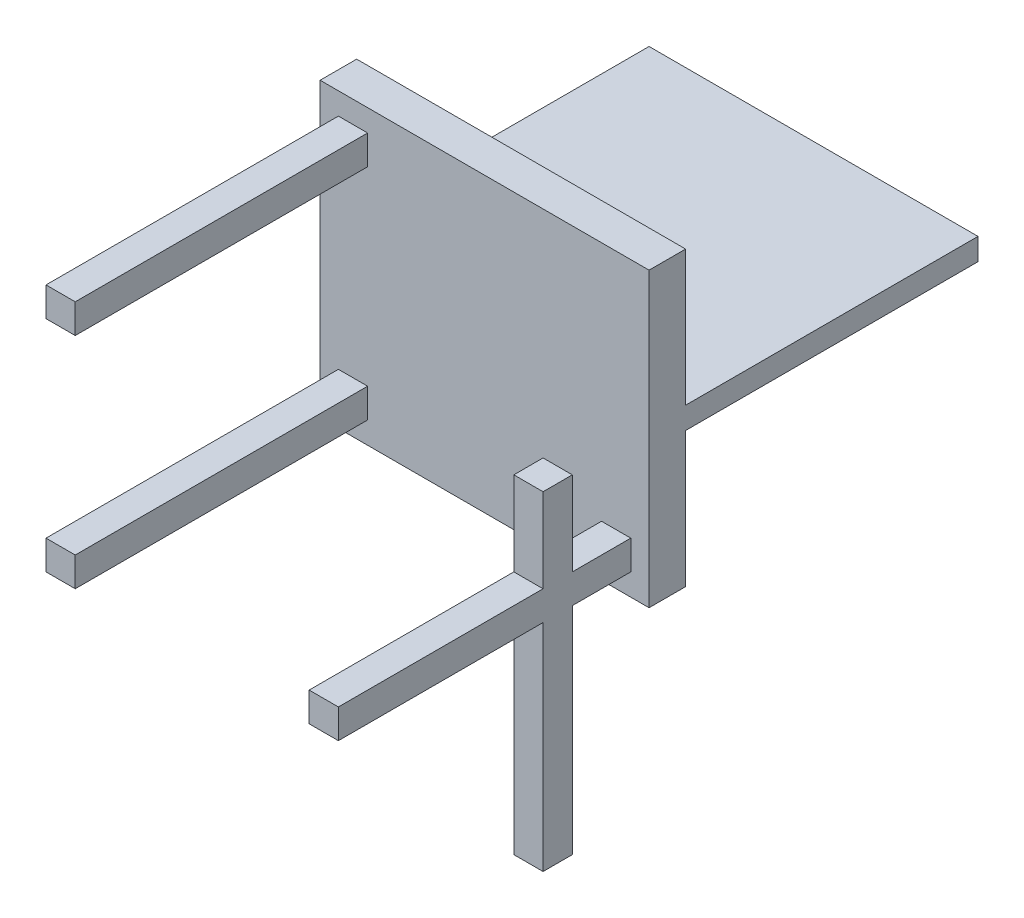
ISO-10303-21;
HEADER;
FILE_DESCRIPTION(('STEP AP214'),'2;1');
FILE_NAME('part.step','',(''),(''),'','','');
FILE_SCHEMA(('AUTOMOTIVE_DESIGN { 1 0 10303 214 1 1 1 1 }'));
ENDSEC;
DATA;
#1=APPLICATION_CONTEXT('core data for automotive mechanical design processes');
#2=APPLICATION_PROTOCOL_DEFINITION('international standard','automotive_design',2000,#1);
#3=PRODUCT_CONTEXT('',#1,'mechanical');
#4=PRODUCT('Part','Part','',(#3));
#5=PRODUCT_RELATED_PRODUCT_CATEGORY('part','',(#4));
#6=PRODUCT_DEFINITION_FORMATION('','',#4);
#7=PRODUCT_DEFINITION_CONTEXT('part definition',#1,'design');
#8=PRODUCT_DEFINITION('design','',#6,#7);
#9=PRODUCT_DEFINITION_SHAPE('','',#8);
#10=(LENGTH_UNIT() NAMED_UNIT(*) SI_UNIT(.MILLI.,.METRE.));
#11=(NAMED_UNIT(*) PLANE_ANGLE_UNIT() SI_UNIT($,.RADIAN.));
#12=(NAMED_UNIT(*) SI_UNIT($,.STERADIAN.) SOLID_ANGLE_UNIT());
#13=UNCERTAINTY_MEASURE_WITH_UNIT(LENGTH_MEASURE(1.E-05),#10,'distance_accuracy_value','');
#14=(GEOMETRIC_REPRESENTATION_CONTEXT(3) GLOBAL_UNCERTAINTY_ASSIGNED_CONTEXT((#13)) GLOBAL_UNIT_ASSIGNED_CONTEXT((#10,
#11,#12)) REPRESENTATION_CONTEXT('',''));
#15=CARTESIAN_POINT('',(0.,0.,0.));
#16=DIRECTION('',(0.,0.,1.));
#17=DIRECTION('',(1.,0.,0.));
#18=AXIS2_PLACEMENT_3D('',#15,#16,#17);
#19=CARTESIAN_POINT('',(0.,0.,50.));
#20=DIRECTION('',(0.,0.,-1.));
#21=DIRECTION('',(-1.,0.,0.));
#22=AXIS2_PLACEMENT_3D('',#19,#20,#21);
#23=PLANE('',#22);
#24=DIRECTION('',(0.,-1.,0.));
#25=VECTOR('',#24,1.);
#26=CARTESIAN_POINT('',(200.,-465.,50.));
#27=LINE('',#26,#25);
#28=CARTESIAN_POINT('',(200.,-130.,50.));
#29=VERTEX_POINT('',#28);
#30=CARTESIAN_POINT('',(200.,-170.,50.));
#31=VERTEX_POINT('',#30);
#32=EDGE_CURVE('E353',#29,#31,#27,.T.);
#33=ORIENTED_EDGE('',*,*,#32,.T.);
#34=DIRECTION('',(-1.,0.,0.));
#35=VECTOR('',#34,1.);
#36=CARTESIAN_POINT('',(160.,-170.,50.));
#37=LINE('',#36,#35);
#38=CARTESIAN_POINT('',(160.,-170.,50.));
#39=VERTEX_POINT('',#38);
#40=EDGE_CURVE('E356',#31,#39,#37,.T.);
#41=ORIENTED_EDGE('',*,*,#40,.T.);
#42=DIRECTION('',(0.,1.,0.));
#43=VECTOR('',#42,1.);
#44=CARTESIAN_POINT('',(160.,-465.,50.));
#45=LINE('',#44,#43);
#46=CARTESIAN_POINT('',(160.,-130.,50.));
#47=VERTEX_POINT('',#46);
#48=EDGE_CURVE('E350',#39,#47,#45,.T.);
#49=ORIENTED_EDGE('',*,*,#48,.T.);
#50=DIRECTION('',(1.,0.,0.));
#51=VECTOR('',#50,1.);
#52=CARTESIAN_POINT('',(160.,-130.,50.));
#53=LINE('',#52,#51);
#54=EDGE_CURVE('E11',#47,#29,#53,.T.);
#55=ORIENTED_EDGE('',*,*,#54,.T.);
#56=EDGE_LOOP('',(#33,#41,#49,#55));
#57=FACE_BOUND('',#56,.T.);
#58=DIRECTION('',(0.,1.,0.));
#59=VECTOR('',#58,1.);
#60=CARTESIAN_POINT('',(-160.,0.,50.));
#61=LINE('',#60,#59);
#62=CARTESIAN_POINT('',(-160.,130.,50.));
#63=VERTEX_POINT('',#62);
#64=CARTESIAN_POINT('',(-160.,170.,50.));
#65=VERTEX_POINT('',#64);
#66=EDGE_CURVE('E287',#63,#65,#61,.T.);
#67=ORIENTED_EDGE('',*,*,#66,.F.);
#68=DIRECTION('',(1.,0.,0.));
#69=VECTOR('',#68,1.);
#70=CARTESIAN_POINT('',(0.,130.,50.));
#71=LINE('',#70,#69);
#72=CARTESIAN_POINT('',(-200.,130.,50.));
#73=VERTEX_POINT('',#72);
#74=EDGE_CURVE('E278',#73,#63,#71,.T.);
#75=ORIENTED_EDGE('',*,*,#74,.F.);
#76=DIRECTION('',(0.,-1.,0.));
#77=VECTOR('',#76,1.);
#78=CARTESIAN_POINT('',(-200.,0.,50.));
#79=LINE('',#78,#77);
#80=CARTESIAN_POINT('',(-200.,170.,50.));
#81=VERTEX_POINT('',#80);
#82=EDGE_CURVE('E281',#81,#73,#79,.T.);
#83=ORIENTED_EDGE('',*,*,#82,.F.);
#84=DIRECTION('',(-1.,0.,0.));
#85=VECTOR('',#84,1.);
#86=CARTESIAN_POINT('',(0.,170.,50.));
#87=LINE('',#86,#85);
#88=EDGE_CURVE('E284',#65,#81,#87,.T.);
#89=ORIENTED_EDGE('',*,*,#88,.F.);
#90=EDGE_LOOP('',(#67,#75,#83,#89));
#91=FACE_BOUND('',#90,.T.);
#92=DIRECTION('',(0.,1.,0.));
#93=VECTOR('',#92,1.);
#94=CARTESIAN_POINT('',(225.,-200.,50.));
#95=LINE('',#94,#93);
#96=CARTESIAN_POINT('',(225.,-200.,50.));
#97=VERTEX_POINT('',#96);
#98=CARTESIAN_POINT('',(225.,200.,50.));
#99=VERTEX_POINT('',#98);
#100=EDGE_CURVE('E318',#97,#99,#95,.T.);
#101=ORIENTED_EDGE('',*,*,#100,.T.);
#102=DIRECTION('',(-1.,0.,0.));
#103=VECTOR('',#102,1.);
#104=CARTESIAN_POINT('',(-225.,200.,50.));
#105=LINE('',#104,#103);
#106=CARTESIAN_POINT('',(-225.,200.,50.));
#107=VERTEX_POINT('',#106);
#108=EDGE_CURVE('E321',#99,#107,#105,.T.);
#109=ORIENTED_EDGE('',*,*,#108,.T.);
#110=DIRECTION('',(0.,-1.,0.));
#111=VECTOR('',#110,1.);
#112=CARTESIAN_POINT('',(-225.,-200.,50.));
#113=LINE('',#112,#111);
#114=CARTESIAN_POINT('',(-225.,-200.,50.));
#115=VERTEX_POINT('',#114);
#116=EDGE_CURVE('E324',#107,#115,#113,.T.);
#117=ORIENTED_EDGE('',*,*,#116,.T.);
#118=DIRECTION('',(1.,0.,0.));
#119=VECTOR('',#118,1.);
#120=CARTESIAN_POINT('',(-225.,-200.,50.));
#121=LINE('',#120,#119);
#122=EDGE_CURVE('E326',#115,#97,#121,.T.);
#123=ORIENTED_EDGE('',*,*,#122,.T.);
#124=EDGE_LOOP('',(#101,#109,#117,#123));
#125=FACE_BOUND('',#124,.T.);
#126=DIRECTION('',(0.,1.,0.));
#127=VECTOR('',#126,1.);
#128=CARTESIAN_POINT('',(-160.,0.,50.));
#129=LINE('',#128,#127);
#130=CARTESIAN_POINT('',(-160.,-170.,50.));
#131=VERTEX_POINT('',#130);
#132=CARTESIAN_POINT('',(-160.,-130.,50.));
#133=VERTEX_POINT('',#132);
#134=EDGE_CURVE('E245',#131,#133,#129,.T.);
#135=ORIENTED_EDGE('',*,*,#134,.F.);
#136=DIRECTION('',(1.,0.,0.));
#137=VECTOR('',#136,1.);
#138=CARTESIAN_POINT('',(0.,-170.,50.));
#139=LINE('',#138,#137);
#140=CARTESIAN_POINT('',(-200.,-170.,50.));
#141=VERTEX_POINT('',#140);
#142=EDGE_CURVE('E246',#141,#131,#139,.T.);
#143=ORIENTED_EDGE('',*,*,#142,.F.);
#144=DIRECTION('',(0.,-1.,0.));
#145=VECTOR('',#144,1.);
#146=CARTESIAN_POINT('',(-200.,0.,50.));
#147=LINE('',#146,#145);
#148=CARTESIAN_POINT('',(-200.,-130.,50.));
#149=VERTEX_POINT('',#148);
#150=EDGE_CURVE('E61',#149,#141,#147,.T.);
#151=ORIENTED_EDGE('',*,*,#150,.F.);
#152=DIRECTION('',(-1.,0.,0.));
#153=VECTOR('',#152,1.);
#154=CARTESIAN_POINT('',(0.,-130.,50.));
#155=LINE('',#154,#153);
#156=EDGE_CURVE('E56',#133,#149,#155,.T.);
#157=ORIENTED_EDGE('',*,*,#156,.F.);
#158=EDGE_LOOP('',(#135,#143,#151,#157));
#159=FACE_BOUND('',#158,.T.);
#160=ADVANCED_FACE('F41',(#57,#91,#125,#159),#23,.F.);
#161=CARTESIAN_POINT('',(200.,-465.,130.));
#162=DIRECTION('',(-1.,0.,0.));
#163=DIRECTION('',(0.,0.,1.));
#164=AXIS2_PLACEMENT_3D('',#161,#162,#163);
#165=PLANE('',#164);
#166=ORIENTED_EDGE('',*,*,#32,.F.);
#167=DIRECTION('',(0.,0.,-1.));
#168=VECTOR('',#167,1.);
#169=CARTESIAN_POINT('',(200.,-130.,450.));
#170=LINE('',#169,#168);
#171=CARTESIAN_POINT('',(200.,-130.,130.));
#172=VERTEX_POINT('',#171);
#173=EDGE_CURVE('E380',#172,#29,#170,.T.);
#174=ORIENTED_EDGE('',*,*,#173,.F.);
#175=DIRECTION('',(0.,1.,0.));
#176=VECTOR('',#175,1.);
#177=CARTESIAN_POINT('',(200.,-465.,130.));
#178=LINE('',#177,#176);
#179=CARTESIAN_POINT('',(200.,-15.,130.));
#180=VERTEX_POINT('',#179);
#181=EDGE_CURVE('E401',#172,#180,#178,.T.);
#182=ORIENTED_EDGE('',*,*,#181,.T.);
#183=DIRECTION('',(0.,0.,1.));
#184=VECTOR('',#183,1.);
#185=CARTESIAN_POINT('',(200.,-15.,130.));
#186=LINE('',#185,#184);
#187=CARTESIAN_POINT('',(200.,-15.,170.));
#188=VERTEX_POINT('',#187);
#189=EDGE_CURVE('E390',#180,#188,#186,.T.);
#190=ORIENTED_EDGE('',*,*,#189,.T.);
#191=DIRECTION('',(0.,1.,0.));
#192=VECTOR('',#191,1.);
#193=CARTESIAN_POINT('',(200.,-465.,170.));
#194=LINE('',#193,#192);
#195=CARTESIAN_POINT('',(200.,-130.,170.));
#196=VERTEX_POINT('',#195);
#197=EDGE_CURVE('E422',#196,#188,#194,.T.);
#198=ORIENTED_EDGE('',*,*,#197,.F.);
#199=CARTESIAN_POINT('',(200.,-130.,450.));
#200=VERTEX_POINT('',#199);
#201=EDGE_CURVE('E381',#200,#196,#170,.T.);
#202=ORIENTED_EDGE('',*,*,#201,.F.);
#203=DIRECTION('',(0.,1.,0.));
#204=VECTOR('',#203,1.);
#205=CARTESIAN_POINT('',(200.,-170.,450.));
#206=LINE('',#205,#204);
#207=CARTESIAN_POINT('',(200.,-170.,450.));
#208=VERTEX_POINT('',#207);
#209=EDGE_CURVE('E359',#208,#200,#206,.T.);
#210=ORIENTED_EDGE('',*,*,#209,.F.);
#211=DIRECTION('',(0.,0.,-1.));
#212=VECTOR('',#211,1.);
#213=CARTESIAN_POINT('',(200.,-170.,450.));
#214=LINE('',#213,#212);
#215=CARTESIAN_POINT('',(200.,-170.,170.));
#216=VERTEX_POINT('',#215);
#217=EDGE_CURVE('E369',#208,#216,#214,.T.);
#218=ORIENTED_EDGE('',*,*,#217,.T.);
#219=CARTESIAN_POINT('',(200.,-465.,170.));
#220=VERTEX_POINT('',#219);
#221=EDGE_CURVE('E423',#220,#216,#194,.T.);
#222=ORIENTED_EDGE('',*,*,#221,.F.);
#223=DIRECTION('',(0.,0.,1.));
#224=VECTOR('',#223,1.);
#225=CARTESIAN_POINT('',(200.,-465.,130.));
#226=LINE('',#225,#224);
#227=CARTESIAN_POINT('',(200.,-465.,130.));
#228=VERTEX_POINT('',#227);
#229=EDGE_CURVE('E391',#228,#220,#226,.T.);
#230=ORIENTED_EDGE('',*,*,#229,.F.);
#231=CARTESIAN_POINT('',(200.,-170.,130.));
#232=VERTEX_POINT('',#231);
#233=EDGE_CURVE('E412',#228,#232,#178,.T.);
#234=ORIENTED_EDGE('',*,*,#233,.T.);
#235=EDGE_CURVE('E368',#232,#31,#214,.T.);
#236=ORIENTED_EDGE('',*,*,#235,.T.);
#237=EDGE_LOOP('',(#166,#174,#182,#190,#198,#202,#210,#218,#222,#230,#234,#236));
#238=FACE_BOUND('',#237,.T.);
#239=ADVANCED_FACE('F43',(#238),#165,.F.);
#240=CARTESIAN_POINT('',(160.,-465.,130.));
#241=DIRECTION('',(1.,0.,0.));
#242=DIRECTION('',(0.,0.,-1.));
#243=AXIS2_PLACEMENT_3D('',#240,#241,#242);
#244=PLANE('',#243);
#245=ORIENTED_EDGE('',*,*,#48,.F.);
#246=DIRECTION('',(0.,0.,-1.));
#247=VECTOR('',#246,1.);
#248=CARTESIAN_POINT('',(160.,-170.,450.));
#249=LINE('',#248,#247);
#250=CARTESIAN_POINT('',(160.,-170.,130.));
#251=VERTEX_POINT('',#250);
#252=EDGE_CURVE('E372',#251,#39,#249,.T.);
#253=ORIENTED_EDGE('',*,*,#252,.F.);
#254=DIRECTION('',(0.,1.,0.));
#255=VECTOR('',#254,1.);
#256=CARTESIAN_POINT('',(160.,-465.,130.));
#257=LINE('',#256,#255);
#258=CARTESIAN_POINT('',(160.,-465.,130.));
#259=VERTEX_POINT('',#258);
#260=EDGE_CURVE('E416',#259,#251,#257,.T.);
#261=ORIENTED_EDGE('',*,*,#260,.F.);
#262=DIRECTION('',(0.,0.,-1.));
#263=VECTOR('',#262,1.);
#264=CARTESIAN_POINT('',(160.,-465.,130.));
#265=LINE('',#264,#263);
#266=CARTESIAN_POINT('',(160.,-465.,170.));
#267=VERTEX_POINT('',#266);
#268=EDGE_CURVE('E397',#267,#259,#265,.T.);
#269=ORIENTED_EDGE('',*,*,#268,.F.);
#270=DIRECTION('',(0.,1.,0.));
#271=VECTOR('',#270,1.);
#272=CARTESIAN_POINT('',(160.,-465.,170.));
#273=LINE('',#272,#271);
#274=CARTESIAN_POINT('',(160.,-170.,170.));
#275=VERTEX_POINT('',#274);
#276=EDGE_CURVE('E419',#267,#275,#273,.T.);
#277=ORIENTED_EDGE('',*,*,#276,.T.);
#278=CARTESIAN_POINT('',(160.,-170.,450.));
#279=VERTEX_POINT('',#278);
#280=EDGE_CURVE('E373',#279,#275,#249,.T.);
#281=ORIENTED_EDGE('',*,*,#280,.F.);
#282=DIRECTION('',(0.,-1.,0.));
#283=VECTOR('',#282,1.);
#284=CARTESIAN_POINT('',(160.,-170.,450.));
#285=LINE('',#284,#283);
#286=CARTESIAN_POINT('',(160.,-130.,450.));
#287=VERTEX_POINT('',#286);
#288=EDGE_CURVE('E364',#287,#279,#285,.T.);
#289=ORIENTED_EDGE('',*,*,#288,.F.);
#290=DIRECTION('',(0.,0.,-1.));
#291=VECTOR('',#290,1.);
#292=CARTESIAN_POINT('',(160.,-130.,450.));
#293=LINE('',#292,#291);
#294=CARTESIAN_POINT('',(160.,-130.,170.));
#295=VERTEX_POINT('',#294);
#296=EDGE_CURVE('E377',#287,#295,#293,.T.);
#297=ORIENTED_EDGE('',*,*,#296,.T.);
#298=CARTESIAN_POINT('',(160.,-15.,170.));
#299=VERTEX_POINT('',#298);
#300=EDGE_CURVE('E418',#295,#299,#273,.T.);
#301=ORIENTED_EDGE('',*,*,#300,.T.);
#302=DIRECTION('',(0.,0.,-1.));
#303=VECTOR('',#302,1.);
#304=CARTESIAN_POINT('',(160.,-15.,130.));
#305=LINE('',#304,#303);
#306=CARTESIAN_POINT('',(160.,-15.,130.));
#307=VERTEX_POINT('',#306);
#308=EDGE_CURVE('E407',#299,#307,#305,.T.);
#309=ORIENTED_EDGE('',*,*,#308,.T.);
#310=CARTESIAN_POINT('',(160.,-130.,130.));
#311=VERTEX_POINT('',#310);
#312=EDGE_CURVE('E415',#311,#307,#257,.T.);
#313=ORIENTED_EDGE('',*,*,#312,.F.);
#314=EDGE_CURVE('E376',#311,#47,#293,.T.);
#315=ORIENTED_EDGE('',*,*,#314,.T.);
#316=EDGE_LOOP('',(#245,#253,#261,#269,#277,#281,#289,#297,#301,#309,#313,#315));
#317=FACE_BOUND('',#316,.T.);
#318=ADVANCED_FACE('F442',(#317),#244,.F.);
#319=CARTESIAN_POINT('',(160.,-170.,450.));
#320=DIRECTION('',(0.,1.,0.));
#321=DIRECTION('',(0.,0.,1.));
#322=AXIS2_PLACEMENT_3D('',#319,#320,#321);
#323=PLANE('',#322);
#324=ORIENTED_EDGE('',*,*,#40,.F.);
#325=ORIENTED_EDGE('',*,*,#235,.F.);
#326=DIRECTION('',(-1.,0.,0.));
#327=VECTOR('',#326,1.);
#328=CARTESIAN_POINT('',(160.,-170.,130.));
#329=LINE('',#328,#327);
#330=EDGE_CURVE('E425',#232,#251,#329,.T.);
#331=ORIENTED_EDGE('',*,*,#330,.T.);
#332=ORIENTED_EDGE('',*,*,#252,.T.);
#333=EDGE_LOOP('',(#324,#325,#331,#332));
#334=FACE_BOUND('',#333,.T.);
#335=ADVANCED_FACE('F480',(#334),#323,.F.);
#336=CARTESIAN_POINT('',(160.,-130.,450.));
#337=DIRECTION('',(0.,-1.,0.));
#338=DIRECTION('',(0.,0.,-1.));
#339=AXIS2_PLACEMENT_3D('',#336,#337,#338);
#340=PLANE('',#339);
#341=ORIENTED_EDGE('',*,*,#54,.F.);
#342=ORIENTED_EDGE('',*,*,#314,.F.);
#343=DIRECTION('',(1.,0.,0.));
#344=VECTOR('',#343,1.);
#345=CARTESIAN_POINT('',(160.,-130.,130.));
#346=LINE('',#345,#344);
#347=EDGE_CURVE('E49',#311,#172,#346,.T.);
#348=ORIENTED_EDGE('',*,*,#347,.T.);
#349=ORIENTED_EDGE('',*,*,#173,.T.);
#350=EDGE_LOOP('',(#341,#342,#348,#349));
#351=FACE_BOUND('',#350,.T.);
#352=ADVANCED_FACE('F431',(#351),#340,.F.);
#353=CARTESIAN_POINT('',(160.,-465.,170.));
#354=DIRECTION('',(0.,0.,-1.));
#355=DIRECTION('',(-1.,0.,0.));
#356=AXIS2_PLACEMENT_3D('',#353,#354,#355);
#357=PLANE('',#356);
#358=DIRECTION('',(-1.,0.,0.));
#359=VECTOR('',#358,1.);
#360=CARTESIAN_POINT('',(160.,-130.,170.));
#361=LINE('',#360,#359);
#362=EDGE_CURVE('E387',#196,#295,#361,.T.);
#363=ORIENTED_EDGE('',*,*,#362,.F.);
#364=ORIENTED_EDGE('',*,*,#197,.T.);
#365=DIRECTION('',(-1.,0.,0.));
#366=VECTOR('',#365,1.);
#367=CARTESIAN_POINT('',(160.,-15.,170.));
#368=LINE('',#367,#366);
#369=EDGE_CURVE('E404',#188,#299,#368,.T.);
#370=ORIENTED_EDGE('',*,*,#369,.T.);
#371=ORIENTED_EDGE('',*,*,#300,.F.);
#372=EDGE_LOOP('',(#363,#364,#370,#371));
#373=FACE_BOUND('',#372,.T.);
#374=ADVANCED_FACE('F559',(#373),#357,.F.);
#375=DIRECTION('',(1.,0.,0.));
#376=VECTOR('',#375,1.);
#377=CARTESIAN_POINT('',(160.,-170.,170.));
#378=LINE('',#377,#376);
#379=EDGE_CURVE('E384',#275,#216,#378,.T.);
#380=ORIENTED_EDGE('',*,*,#379,.F.);
#381=ORIENTED_EDGE('',*,*,#276,.F.);
#382=DIRECTION('',(-1.,0.,0.));
#383=VECTOR('',#382,1.);
#384=CARTESIAN_POINT('',(160.,-465.,170.));
#385=LINE('',#384,#383);
#386=EDGE_CURVE('E394',#220,#267,#385,.T.);
#387=ORIENTED_EDGE('',*,*,#386,.F.);
#388=ORIENTED_EDGE('',*,*,#221,.T.);
#389=EDGE_LOOP('',(#380,#381,#387,#388));
#390=FACE_BOUND('',#389,.T.);
#391=ADVANCED_FACE('F471',(#390),#357,.F.);
#392=CARTESIAN_POINT('',(160.,-465.,130.));
#393=DIRECTION('',(0.,0.,1.));
#394=DIRECTION('',(1.,0.,0.));
#395=AXIS2_PLACEMENT_3D('',#392,#393,#394);
#396=PLANE('',#395);
#397=ORIENTED_EDGE('',*,*,#347,.F.);
#398=ORIENTED_EDGE('',*,*,#312,.T.);
#399=DIRECTION('',(1.,0.,0.));
#400=VECTOR('',#399,1.);
#401=CARTESIAN_POINT('',(160.,-15.,130.));
#402=LINE('',#401,#400);
#403=EDGE_CURVE('E395',#307,#180,#402,.T.);
#404=ORIENTED_EDGE('',*,*,#403,.T.);
#405=ORIENTED_EDGE('',*,*,#181,.F.);
#406=EDGE_LOOP('',(#397,#398,#404,#405));
#407=FACE_BOUND('',#406,.T.);
#408=ADVANCED_FACE('F447',(#407),#396,.F.);
#409=ORIENTED_EDGE('',*,*,#330,.F.);
#410=ORIENTED_EDGE('',*,*,#233,.F.);
#411=DIRECTION('',(1.,0.,0.));
#412=VECTOR('',#411,1.);
#413=CARTESIAN_POINT('',(160.,-465.,130.));
#414=LINE('',#413,#412);
#415=EDGE_CURVE('E399',#259,#228,#414,.T.);
#416=ORIENTED_EDGE('',*,*,#415,.F.);
#417=ORIENTED_EDGE('',*,*,#260,.T.);
#418=EDGE_LOOP('',(#409,#410,#416,#417));
#419=FACE_BOUND('',#418,.T.);
#420=ADVANCED_FACE('F481',(#419),#396,.F.);
#421=CARTESIAN_POINT('',(0.,-465.,0.));
#422=DIRECTION('',(0.,1.,0.));
#423=DIRECTION('',(0.,0.,1.));
#424=AXIS2_PLACEMENT_3D('',#421,#422,#423);
#425=PLANE('',#424);
#426=ORIENTED_EDGE('',*,*,#229,.T.);
#427=ORIENTED_EDGE('',*,*,#386,.T.);
#428=ORIENTED_EDGE('',*,*,#268,.T.);
#429=ORIENTED_EDGE('',*,*,#415,.T.);
#430=EDGE_LOOP('',(#426,#427,#428,#429));
#431=FACE_BOUND('',#430,.T.);
#432=ADVANCED_FACE('F476',(#431),#425,.F.);
#433=CARTESIAN_POINT('',(0.,-15.,0.));
#434=DIRECTION('',(0.,1.,0.));
#435=DIRECTION('',(0.,0.,1.));
#436=AXIS2_PLACEMENT_3D('',#433,#434,#435);
#437=PLANE('',#436);
#438=ORIENTED_EDGE('',*,*,#189,.F.);
#439=ORIENTED_EDGE('',*,*,#403,.F.);
#440=ORIENTED_EDGE('',*,*,#308,.F.);
#441=ORIENTED_EDGE('',*,*,#369,.F.);
#442=EDGE_LOOP('',(#438,#439,#440,#441));
#443=FACE_BOUND('',#442,.T.);
#444=ADVANCED_FACE('F451',(#443),#437,.T.);
#445=ORIENTED_EDGE('',*,*,#201,.T.);
#446=ORIENTED_EDGE('',*,*,#362,.T.);
#447=ORIENTED_EDGE('',*,*,#296,.F.);
#448=DIRECTION('',(-1.,0.,0.));
#449=VECTOR('',#448,1.);
#450=CARTESIAN_POINT('',(160.,-130.,450.));
#451=LINE('',#450,#449);
#452=EDGE_CURVE('E362',#200,#287,#451,.T.);
#453=ORIENTED_EDGE('',*,*,#452,.F.);
#454=EDGE_LOOP('',(#445,#446,#447,#453));
#455=FACE_BOUND('',#454,.T.);
#456=ADVANCED_FACE('F457',(#455),#340,.F.);
#457=ORIENTED_EDGE('',*,*,#280,.T.);
#458=ORIENTED_EDGE('',*,*,#379,.T.);
#459=ORIENTED_EDGE('',*,*,#217,.F.);
#460=DIRECTION('',(1.,0.,0.));
#461=VECTOR('',#460,1.);
#462=CARTESIAN_POINT('',(160.,-170.,450.));
#463=LINE('',#462,#461);
#464=EDGE_CURVE('E366',#279,#208,#463,.T.);
#465=ORIENTED_EDGE('',*,*,#464,.F.);
#466=EDGE_LOOP('',(#457,#458,#459,#465));
#467=FACE_BOUND('',#466,.T.);
#468=ADVANCED_FACE('F467',(#467),#323,.F.);
#469=CARTESIAN_POINT('',(0.,0.,450.));
#470=DIRECTION('',(0.,0.,-1.));
#471=DIRECTION('',(-1.,0.,0.));
#472=AXIS2_PLACEMENT_3D('',#469,#470,#471);
#473=PLANE('',#472);
#474=ORIENTED_EDGE('',*,*,#209,.T.);
#475=ORIENTED_EDGE('',*,*,#452,.T.);
#476=ORIENTED_EDGE('',*,*,#288,.T.);
#477=ORIENTED_EDGE('',*,*,#464,.T.);
#478=EDGE_LOOP('',(#474,#475,#476,#477));
#479=FACE_BOUND('',#478,.T.);
#480=ADVANCED_FACE('F461',(#479),#473,.F.);
#481=CARTESIAN_POINT('',(225.,-200.,50.));
#482=DIRECTION('',(-1.,0.,0.));
#483=DIRECTION('',(0.,0.,1.));
#484=AXIS2_PLACEMENT_3D('',#481,#482,#483);
#485=PLANE('',#484);
#486=DIRECTION('',(0.,1.,0.));
#487=VECTOR('',#486,1.);
#488=CARTESIAN_POINT('',(225.,-200.,0.));
#489=LINE('',#488,#487);
#490=CARTESIAN_POINT('',(225.,-200.,0.));
#491=VERTEX_POINT('',#490);
#492=CARTESIAN_POINT('',(225.,-15.,0.));
#493=VERTEX_POINT('',#492);
#494=EDGE_CURVE('E329',#491,#493,#489,.T.);
#495=ORIENTED_EDGE('',*,*,#494,.T.);
#496=DIRECTION('',(0.,0.,1.));
#497=VECTOR('',#496,1.);
#498=CARTESIAN_POINT('',(225.,-15.,-400.));
#499=LINE('',#498,#497);
#500=CARTESIAN_POINT('',(225.,-15.,-400.));
#501=VERTEX_POINT('',#500);
#502=EDGE_CURVE('E308',#501,#493,#499,.T.);
#503=ORIENTED_EDGE('',*,*,#502,.F.);
#504=DIRECTION('',(0.,-1.,0.));
#505=VECTOR('',#504,1.);
#506=CARTESIAN_POINT('',(225.,-15.,-400.));
#507=LINE('',#506,#505);
#508=CARTESIAN_POINT('',(225.,15.,-400.));
#509=VERTEX_POINT('',#508);
#510=EDGE_CURVE('E297',#509,#501,#507,.T.);
#511=ORIENTED_EDGE('',*,*,#510,.F.);
#512=DIRECTION('',(0.,0.,1.));
#513=VECTOR('',#512,1.);
#514=CARTESIAN_POINT('',(225.,15.,-400.));
#515=LINE('',#514,#513);
#516=CARTESIAN_POINT('',(225.,15.,0.));
#517=VERTEX_POINT('',#516);
#518=EDGE_CURVE('E311',#509,#517,#515,.T.);
#519=ORIENTED_EDGE('',*,*,#518,.T.);
#520=CARTESIAN_POINT('',(225.,200.,0.));
#521=VERTEX_POINT('',#520);
#522=EDGE_CURVE('E317',#517,#521,#489,.T.);
#523=ORIENTED_EDGE('',*,*,#522,.T.);
#524=DIRECTION('',(0.,0.,-1.));
#525=VECTOR('',#524,1.);
#526=CARTESIAN_POINT('',(225.,200.,50.));
#527=LINE('',#526,#525);
#528=EDGE_CURVE('E347',#99,#521,#527,.T.);
#529=ORIENTED_EDGE('',*,*,#528,.F.);
#530=ORIENTED_EDGE('',*,*,#100,.F.);
#531=DIRECTION('',(0.,0.,-1.));
#532=VECTOR('',#531,1.);
#533=CARTESIAN_POINT('',(225.,-200.,50.));
#534=LINE('',#533,#532);
#535=EDGE_CURVE('E328',#97,#491,#534,.T.);
#536=ORIENTED_EDGE('',*,*,#535,.T.);
#537=EDGE_LOOP('',(#495,#503,#511,#519,#523,#529,#530,#536));
#538=FACE_BOUND('',#537,.T.);
#539=ADVANCED_FACE('F515',(#538),#485,.F.);
#540=CARTESIAN_POINT('',(-225.,200.,50.));
#541=DIRECTION('',(0.,-1.,0.));
#542=DIRECTION('',(0.,0.,-1.));
#543=AXIS2_PLACEMENT_3D('',#540,#541,#542);
#544=PLANE('',#543);
#545=DIRECTION('',(-1.,0.,0.));
#546=VECTOR('',#545,1.);
#547=CARTESIAN_POINT('',(-225.,200.,0.));
#548=LINE('',#547,#546);
#549=CARTESIAN_POINT('',(-225.,200.,0.));
#550=VERTEX_POINT('',#549);
#551=EDGE_CURVE('E332',#521,#550,#548,.T.);
#552=ORIENTED_EDGE('',*,*,#551,.T.);
#553=DIRECTION('',(0.,0.,-1.));
#554=VECTOR('',#553,1.);
#555=CARTESIAN_POINT('',(-225.,200.,50.));
#556=LINE('',#555,#554);
#557=EDGE_CURVE('E344',#107,#550,#556,.T.);
#558=ORIENTED_EDGE('',*,*,#557,.F.);
#559=ORIENTED_EDGE('',*,*,#108,.F.);
#560=ORIENTED_EDGE('',*,*,#528,.T.);
#561=EDGE_LOOP('',(#552,#558,#559,#560));
#562=FACE_BOUND('',#561,.T.);
#563=ADVANCED_FACE('F511',(#562),#544,.F.);
#564=CARTESIAN_POINT('',(-225.,-200.,50.));
#565=DIRECTION('',(1.,0.,0.));
#566=DIRECTION('',(0.,0.,-1.));
#567=AXIS2_PLACEMENT_3D('',#564,#565,#566);
#568=PLANE('',#567);
#569=DIRECTION('',(0.,-1.,0.));
#570=VECTOR('',#569,1.);
#571=CARTESIAN_POINT('',(-225.,-200.,0.));
#572=LINE('',#571,#570);
#573=CARTESIAN_POINT('',(-225.,15.,0.));
#574=VERTEX_POINT('',#573);
#575=EDGE_CURVE('E335',#550,#574,#572,.T.);
#576=ORIENTED_EDGE('',*,*,#575,.T.);
#577=DIRECTION('',(0.,0.,1.));
#578=VECTOR('',#577,1.);
#579=CARTESIAN_POINT('',(-225.,15.,-400.));
#580=LINE('',#579,#578);
#581=CARTESIAN_POINT('',(-225.,15.,-400.));
#582=VERTEX_POINT('',#581);
#583=EDGE_CURVE('E314',#582,#574,#580,.T.);
#584=ORIENTED_EDGE('',*,*,#583,.F.);
#585=DIRECTION('',(0.,1.,0.));
#586=VECTOR('',#585,1.);
#587=CARTESIAN_POINT('',(-225.,-15.,-400.));
#588=LINE('',#587,#586);
#589=CARTESIAN_POINT('',(-225.,-15.,-400.));
#590=VERTEX_POINT('',#589);
#591=EDGE_CURVE('E291',#590,#582,#588,.T.);
#592=ORIENTED_EDGE('',*,*,#591,.F.);
#593=DIRECTION('',(0.,0.,1.));
#594=VECTOR('',#593,1.);
#595=CARTESIAN_POINT('',(-225.,-15.,-400.));
#596=LINE('',#595,#594);
#597=CARTESIAN_POINT('',(-225.,-15.,0.));
#598=VERTEX_POINT('',#597);
#599=EDGE_CURVE('E301',#590,#598,#596,.T.);
#600=ORIENTED_EDGE('',*,*,#599,.T.);
#601=CARTESIAN_POINT('',(-225.,-200.,0.));
#602=VERTEX_POINT('',#601);
#603=EDGE_CURVE('E334',#598,#602,#572,.T.);
#604=ORIENTED_EDGE('',*,*,#603,.T.);
#605=DIRECTION('',(0.,0.,-1.));
#606=VECTOR('',#605,1.);
#607=CARTESIAN_POINT('',(-225.,-200.,50.));
#608=LINE('',#607,#606);
#609=EDGE_CURVE('E341',#115,#602,#608,.T.);
#610=ORIENTED_EDGE('',*,*,#609,.F.);
#611=ORIENTED_EDGE('',*,*,#116,.F.);
#612=ORIENTED_EDGE('',*,*,#557,.T.);
#613=EDGE_LOOP('',(#576,#584,#592,#600,#604,#610,#611,#612));
#614=FACE_BOUND('',#613,.T.);
#615=ADVANCED_FACE('F507',(#614),#568,.F.);
#616=CARTESIAN_POINT('',(-225.,-200.,50.));
#617=DIRECTION('',(0.,1.,0.));
#618=DIRECTION('',(0.,0.,1.));
#619=AXIS2_PLACEMENT_3D('',#616,#617,#618);
#620=PLANE('',#619);
#621=DIRECTION('',(1.,0.,0.));
#622=VECTOR('',#621,1.);
#623=CARTESIAN_POINT('',(-225.,-200.,0.));
#624=LINE('',#623,#622);
#625=EDGE_CURVE('E322',#602,#491,#624,.T.);
#626=ORIENTED_EDGE('',*,*,#625,.T.);
#627=ORIENTED_EDGE('',*,*,#535,.F.);
#628=ORIENTED_EDGE('',*,*,#122,.F.);
#629=ORIENTED_EDGE('',*,*,#609,.T.);
#630=EDGE_LOOP('',(#626,#627,#628,#629));
#631=FACE_BOUND('',#630,.T.);
#632=ADVANCED_FACE('F503',(#631),#620,.F.);
#633=CARTESIAN_POINT('',(0.,0.,0.));
#634=DIRECTION('',(0.,0.,-1.));
#635=DIRECTION('',(-1.,0.,0.));
#636=AXIS2_PLACEMENT_3D('',#633,#634,#635);
#637=PLANE('',#636);
#638=DIRECTION('',(1.,0.,0.));
#639=VECTOR('',#638,1.);
#640=CARTESIAN_POINT('',(225.,15.,0.));
#641=LINE('',#640,#639);
#642=EDGE_CURVE('E290',#574,#517,#641,.T.);
#643=ORIENTED_EDGE('',*,*,#642,.F.);
#644=ORIENTED_EDGE('',*,*,#575,.F.);
#645=ORIENTED_EDGE('',*,*,#551,.F.);
#646=ORIENTED_EDGE('',*,*,#522,.F.);
#647=EDGE_LOOP('',(#643,#644,#645,#646));
#648=FACE_BOUND('',#647,.T.);
#649=ADVANCED_FACE('F506',(#648),#637,.T.);
#650=CARTESIAN_POINT('',(225.,15.,-400.));
#651=DIRECTION('',(0.,-1.,0.));
#652=DIRECTION('',(0.,0.,-1.));
#653=AXIS2_PLACEMENT_3D('',#650,#651,#652);
#654=PLANE('',#653);
#655=ORIENTED_EDGE('',*,*,#642,.T.);
#656=ORIENTED_EDGE('',*,*,#518,.F.);
#657=DIRECTION('',(1.,0.,0.));
#658=VECTOR('',#657,1.);
#659=CARTESIAN_POINT('',(225.,15.,-400.));
#660=LINE('',#659,#658);
#661=EDGE_CURVE('E294',#582,#509,#660,.T.);
#662=ORIENTED_EDGE('',*,*,#661,.F.);
#663=ORIENTED_EDGE('',*,*,#583,.T.);
#664=EDGE_LOOP('',(#655,#656,#662,#663));
#665=FACE_BOUND('',#664,.T.);
#666=ADVANCED_FACE('F501',(#665),#654,.F.);
#667=CARTESIAN_POINT('',(225.,-15.,-400.));
#668=DIRECTION('',(0.,1.,0.));
#669=DIRECTION('',(0.,0.,1.));
#670=AXIS2_PLACEMENT_3D('',#667,#668,#669);
#671=PLANE('',#670);
#672=DIRECTION('',(-1.,0.,0.));
#673=VECTOR('',#672,1.);
#674=CARTESIAN_POINT('',(225.,-15.,0.));
#675=LINE('',#674,#673);
#676=EDGE_CURVE('E295',#493,#598,#675,.T.);
#677=ORIENTED_EDGE('',*,*,#676,.T.);
#678=ORIENTED_EDGE('',*,*,#599,.F.);
#679=DIRECTION('',(-1.,0.,0.));
#680=VECTOR('',#679,1.);
#681=CARTESIAN_POINT('',(225.,-15.,-400.));
#682=LINE('',#681,#680);
#683=EDGE_CURVE('E299',#501,#590,#682,.T.);
#684=ORIENTED_EDGE('',*,*,#683,.F.);
#685=ORIENTED_EDGE('',*,*,#502,.T.);
#686=EDGE_LOOP('',(#677,#678,#684,#685));
#687=FACE_BOUND('',#686,.T.);
#688=ADVANCED_FACE('F640',(#687),#671,.F.);
#689=CARTESIAN_POINT('',(0.,0.,-400.));
#690=DIRECTION('',(0.,0.,1.));
#691=DIRECTION('',(1.,0.,0.));
#692=AXIS2_PLACEMENT_3D('',#689,#690,#691);
#693=PLANE('',#692);
#694=ORIENTED_EDGE('',*,*,#591,.T.);
#695=ORIENTED_EDGE('',*,*,#661,.T.);
#696=ORIENTED_EDGE('',*,*,#510,.T.);
#697=ORIENTED_EDGE('',*,*,#683,.T.);
#698=EDGE_LOOP('',(#694,#695,#696,#697));
#699=FACE_BOUND('',#698,.T.);
#700=ADVANCED_FACE('F649',(#699),#693,.F.);
#701=CARTESIAN_POINT('',(-160.,130.,450.));
#702=DIRECTION('',(-1.,0.,0.));
#703=DIRECTION('',(0.,0.,1.));
#704=AXIS2_PLACEMENT_3D('',#701,#702,#703);
#705=PLANE('',#704);
#706=DIRECTION('',(0.,0.,-1.));
#707=VECTOR('',#706,1.);
#708=CARTESIAN_POINT('',(-160.,130.,450.));
#709=LINE('',#708,#707);
#710=CARTESIAN_POINT('',(-160.,130.,450.));
#711=VERTEX_POINT('',#710);
#712=EDGE_CURVE('E266',#711,#63,#709,.T.);
#713=ORIENTED_EDGE('',*,*,#712,.T.);
#714=ORIENTED_EDGE('',*,*,#66,.T.);
#715=DIRECTION('',(0.,0.,-1.));
#716=VECTOR('',#715,1.);
#717=CARTESIAN_POINT('',(-160.,170.,450.));
#718=LINE('',#717,#716);
#719=CARTESIAN_POINT('',(-160.,170.,450.));
#720=VERTEX_POINT('',#719);
#721=EDGE_CURVE('E275',#720,#65,#718,.T.);
#722=ORIENTED_EDGE('',*,*,#721,.F.);
#723=DIRECTION('',(0.,1.,0.));
#724=VECTOR('',#723,1.);
#725=CARTESIAN_POINT('',(-160.,130.,450.));
#726=LINE('',#725,#724);
#727=EDGE_CURVE('E257',#711,#720,#726,.T.);
#728=ORIENTED_EDGE('',*,*,#727,.F.);
#729=EDGE_LOOP('',(#713,#714,#722,#728));
#730=FACE_BOUND('',#729,.T.);
#731=ADVANCED_FACE('F658',(#730),#705,.F.);
#732=CARTESIAN_POINT('',(-200.,170.,450.));
#733=DIRECTION('',(0.,-1.,0.));
#734=DIRECTION('',(0.,0.,-1.));
#735=AXIS2_PLACEMENT_3D('',#732,#733,#734);
#736=PLANE('',#735);
#737=ORIENTED_EDGE('',*,*,#721,.T.);
#738=ORIENTED_EDGE('',*,*,#88,.T.);
#739=DIRECTION('',(0.,0.,-1.));
#740=VECTOR('',#739,1.);
#741=CARTESIAN_POINT('',(-200.,170.,450.));
#742=LINE('',#741,#740);
#743=CARTESIAN_POINT('',(-200.,170.,450.));
#744=VERTEX_POINT('',#743);
#745=EDGE_CURVE('E272',#744,#81,#742,.T.);
#746=ORIENTED_EDGE('',*,*,#745,.F.);
#747=DIRECTION('',(-1.,0.,0.));
#748=VECTOR('',#747,1.);
#749=CARTESIAN_POINT('',(-200.,170.,450.));
#750=LINE('',#749,#748);
#751=EDGE_CURVE('E260',#720,#744,#750,.T.);
#752=ORIENTED_EDGE('',*,*,#751,.F.);
#753=EDGE_LOOP('',(#737,#738,#746,#752));
#754=FACE_BOUND('',#753,.T.);
#755=ADVANCED_FACE('F668',(#754),#736,.F.);
#756=CARTESIAN_POINT('',(-200.,130.,450.));
#757=DIRECTION('',(1.,0.,0.));
#758=DIRECTION('',(0.,0.,-1.));
#759=AXIS2_PLACEMENT_3D('',#756,#757,#758);
#760=PLANE('',#759);
#761=ORIENTED_EDGE('',*,*,#745,.T.);
#762=ORIENTED_EDGE('',*,*,#82,.T.);
#763=DIRECTION('',(0.,0.,-1.));
#764=VECTOR('',#763,1.);
#765=CARTESIAN_POINT('',(-200.,130.,450.));
#766=LINE('',#765,#764);
#767=CARTESIAN_POINT('',(-200.,130.,450.));
#768=VERTEX_POINT('',#767);
#769=EDGE_CURVE('E269',#768,#73,#766,.T.);
#770=ORIENTED_EDGE('',*,*,#769,.F.);
#771=DIRECTION('',(0.,-1.,0.));
#772=VECTOR('',#771,1.);
#773=CARTESIAN_POINT('',(-200.,130.,450.));
#774=LINE('',#773,#772);
#775=EDGE_CURVE('E262',#744,#768,#774,.T.);
#776=ORIENTED_EDGE('',*,*,#775,.F.);
#777=EDGE_LOOP('',(#761,#762,#770,#776));
#778=FACE_BOUND('',#777,.T.);
#779=ADVANCED_FACE('F678',(#778),#760,.F.);
#780=CARTESIAN_POINT('',(-200.,130.,450.));
#781=DIRECTION('',(0.,1.,0.));
#782=DIRECTION('',(0.,0.,1.));
#783=AXIS2_PLACEMENT_3D('',#780,#781,#782);
#784=PLANE('',#783);
#785=ORIENTED_EDGE('',*,*,#769,.T.);
#786=ORIENTED_EDGE('',*,*,#74,.T.);
#787=ORIENTED_EDGE('',*,*,#712,.F.);
#788=DIRECTION('',(1.,0.,0.));
#789=VECTOR('',#788,1.);
#790=CARTESIAN_POINT('',(-200.,130.,450.));
#791=LINE('',#790,#789);
#792=EDGE_CURVE('E264',#768,#711,#791,.T.);
#793=ORIENTED_EDGE('',*,*,#792,.F.);
#794=EDGE_LOOP('',(#785,#786,#787,#793));
#795=FACE_BOUND('',#794,.T.);
#796=ADVANCED_FACE('F688',(#795),#784,.F.);
#797=CARTESIAN_POINT('',(0.,0.,450.));
#798=DIRECTION('',(0.,0.,-1.));
#799=DIRECTION('',(-1.,0.,0.));
#800=AXIS2_PLACEMENT_3D('',#797,#798,#799);
#801=PLANE('',#800);
#802=ORIENTED_EDGE('',*,*,#727,.T.);
#803=ORIENTED_EDGE('',*,*,#751,.T.);
#804=ORIENTED_EDGE('',*,*,#775,.T.);
#805=ORIENTED_EDGE('',*,*,#792,.T.);
#806=EDGE_LOOP('',(#802,#803,#804,#805));
#807=FACE_BOUND('',#806,.T.);
#808=ADVANCED_FACE('F524',(#807),#801,.F.);
#809=ORIENTED_EDGE('',*,*,#676,.F.);
#810=ORIENTED_EDGE('',*,*,#494,.F.);
#811=ORIENTED_EDGE('',*,*,#625,.F.);
#812=ORIENTED_EDGE('',*,*,#603,.F.);
#813=EDGE_LOOP('',(#809,#810,#811,#812));
#814=FACE_BOUND('',#813,.T.);
#815=ADVANCED_FACE('F522',(#814),#637,.T.);
#816=CARTESIAN_POINT('',(-160.,-170.,450.));
#817=DIRECTION('',(-1.,0.,0.));
#818=DIRECTION('',(0.,0.,1.));
#819=AXIS2_PLACEMENT_3D('',#816,#817,#818);
#820=PLANE('',#819);
#821=DIRECTION('',(0.,0.,-1.));
#822=VECTOR('',#821,1.);
#823=CARTESIAN_POINT('',(-160.,-170.,450.));
#824=LINE('',#823,#822);
#825=CARTESIAN_POINT('',(-160.,-170.,450.));
#826=VERTEX_POINT('',#825);
#827=EDGE_CURVE('E784',#826,#131,#824,.T.);
#828=ORIENTED_EDGE('',*,*,#827,.T.);
#829=ORIENTED_EDGE('',*,*,#134,.T.);
#830=DIRECTION('',(0.,0.,-1.));
#831=VECTOR('',#830,1.);
#832=CARTESIAN_POINT('',(-160.,-130.,450.));
#833=LINE('',#832,#831);
#834=CARTESIAN_POINT('',(-160.,-130.,450.));
#835=VERTEX_POINT('',#834);
#836=EDGE_CURVE('E228',#835,#133,#833,.T.);
#837=ORIENTED_EDGE('',*,*,#836,.F.);
#838=DIRECTION('',(0.,1.,0.));
#839=VECTOR('',#838,1.);
#840=CARTESIAN_POINT('',(-160.,-170.,450.));
#841=LINE('',#840,#839);
#842=EDGE_CURVE('E234',#826,#835,#841,.T.);
#843=ORIENTED_EDGE('',*,*,#842,.F.);
#844=EDGE_LOOP('',(#828,#829,#837,#843));
#845=FACE_BOUND('',#844,.T.);
#846=ADVANCED_FACE('F244',(#845),#820,.F.);
#847=CARTESIAN_POINT('',(-200.,-130.,450.));
#848=DIRECTION('',(0.,-1.,0.));
#849=DIRECTION('',(0.,0.,-1.));
#850=AXIS2_PLACEMENT_3D('',#847,#848,#849);
#851=PLANE('',#850);
#852=ORIENTED_EDGE('',*,*,#836,.T.);
#853=ORIENTED_EDGE('',*,*,#156,.T.);
#854=DIRECTION('',(0.,0.,-1.));
#855=VECTOR('',#854,1.);
#856=CARTESIAN_POINT('',(-200.,-130.,450.));
#857=LINE('',#856,#855);
#858=CARTESIAN_POINT('',(-200.,-130.,450.));
#859=VERTEX_POINT('',#858);
#860=EDGE_CURVE('E230',#859,#149,#857,.T.);
#861=ORIENTED_EDGE('',*,*,#860,.F.);
#862=DIRECTION('',(-1.,0.,0.));
#863=VECTOR('',#862,1.);
#864=CARTESIAN_POINT('',(-200.,-130.,450.));
#865=LINE('',#864,#863);
#866=EDGE_CURVE('E224',#835,#859,#865,.T.);
#867=ORIENTED_EDGE('',*,*,#866,.F.);
#868=EDGE_LOOP('',(#852,#853,#861,#867));
#869=FACE_BOUND('',#868,.T.);
#870=ADVANCED_FACE('F226',(#869),#851,.F.);
#871=CARTESIAN_POINT('',(-200.,-170.,450.));
#872=DIRECTION('',(1.,0.,0.));
#873=DIRECTION('',(0.,0.,-1.));
#874=AXIS2_PLACEMENT_3D('',#871,#872,#873);
#875=PLANE('',#874);
#876=ORIENTED_EDGE('',*,*,#860,.T.);
#877=ORIENTED_EDGE('',*,*,#150,.T.);
#878=DIRECTION('',(0.,0.,-1.));
#879=VECTOR('',#878,1.);
#880=CARTESIAN_POINT('',(-200.,-170.,450.));
#881=LINE('',#880,#879);
#882=CARTESIAN_POINT('',(-200.,-170.,450.));
#883=VERTEX_POINT('',#882);
#884=EDGE_CURVE('E250',#883,#141,#881,.T.);
#885=ORIENTED_EDGE('',*,*,#884,.F.);
#886=DIRECTION('',(0.,-1.,0.));
#887=VECTOR('',#886,1.);
#888=CARTESIAN_POINT('',(-200.,-170.,450.));
#889=LINE('',#888,#887);
#890=EDGE_CURVE('E233',#859,#883,#889,.T.);
#891=ORIENTED_EDGE('',*,*,#890,.F.);
#892=EDGE_LOOP('',(#876,#877,#885,#891));
#893=FACE_BOUND('',#892,.T.);
#894=ADVANCED_FACE('F747',(#893),#875,.F.);
#895=CARTESIAN_POINT('',(-200.,-170.,450.));
#896=DIRECTION('',(0.,1.,0.));
#897=DIRECTION('',(0.,0.,1.));
#898=AXIS2_PLACEMENT_3D('',#895,#896,#897);
#899=PLANE('',#898);
#900=ORIENTED_EDGE('',*,*,#884,.T.);
#901=ORIENTED_EDGE('',*,*,#142,.T.);
#902=ORIENTED_EDGE('',*,*,#827,.F.);
#903=DIRECTION('',(1.,0.,0.));
#904=VECTOR('',#903,1.);
#905=CARTESIAN_POINT('',(-200.,-170.,450.));
#906=LINE('',#905,#904);
#907=EDGE_CURVE('E239',#883,#826,#906,.T.);
#908=ORIENTED_EDGE('',*,*,#907,.F.);
#909=EDGE_LOOP('',(#900,#901,#902,#908));
#910=FACE_BOUND('',#909,.T.);
#911=ADVANCED_FACE('F755',(#910),#899,.F.);
#912=CARTESIAN_POINT('',(0.,0.,450.));
#913=DIRECTION('',(0.,0.,-1.));
#914=DIRECTION('',(-1.,0.,0.));
#915=AXIS2_PLACEMENT_3D('',#912,#913,#914);
#916=PLANE('',#915);
#917=ORIENTED_EDGE('',*,*,#842,.T.);
#918=ORIENTED_EDGE('',*,*,#866,.T.);
#919=ORIENTED_EDGE('',*,*,#890,.T.);
#920=ORIENTED_EDGE('',*,*,#907,.T.);
#921=EDGE_LOOP('',(#917,#918,#919,#920));
#922=FACE_BOUND('',#921,.T.);
#923=ADVANCED_FACE('F237',(#922),#916,.F.);
#924=CLOSED_SHELL('',(#160,#239,#318,#335,#352,#374,#391,#408,#420,#432,#444,#456,#468,#480,
#539,#563,#615,#632,#649,#666,#688,#700,#731,#755,#779,#796,#808,#815,#846,#870,#894,#911,#923));
#925=MANIFOLD_SOLID_BREP('B2',#924);
#926=ADVANCED_BREP_SHAPE_REPRESENTATION('',(#18,#925),#14);
#927=SHAPE_DEFINITION_REPRESENTATION(#9,#926);
ENDSEC;
END-ISO-10303-21;
